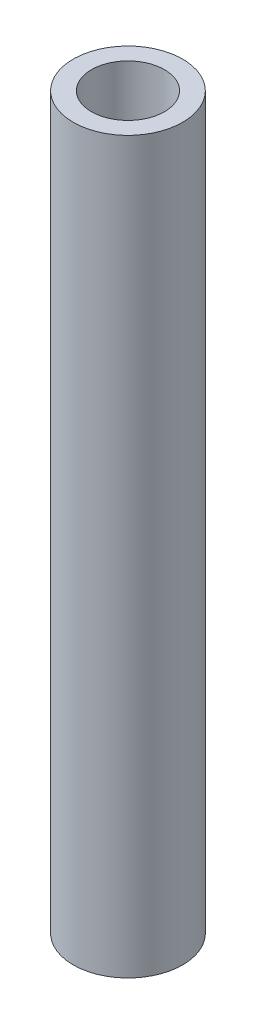
ISO-10303-21;
HEADER;
FILE_DESCRIPTION(('STEP AP214'),'2;1');
FILE_NAME('part.step','',(''),(''),'','','');
FILE_SCHEMA(('AUTOMOTIVE_DESIGN { 1 0 10303 214 1 1 1 1 }'));
ENDSEC;
DATA;
#1=APPLICATION_CONTEXT('core data for automotive mechanical design processes');
#2=APPLICATION_PROTOCOL_DEFINITION('international standard','automotive_design',2000,#1);
#3=PRODUCT_CONTEXT('',#1,'mechanical');
#4=PRODUCT('Part','Part','',(#3));
#5=PRODUCT_RELATED_PRODUCT_CATEGORY('part','',(#4));
#6=PRODUCT_DEFINITION_FORMATION('','',#4);
#7=PRODUCT_DEFINITION_CONTEXT('part definition',#1,'design');
#8=PRODUCT_DEFINITION('design','',#6,#7);
#9=PRODUCT_DEFINITION_SHAPE('','',#8);
#10=(LENGTH_UNIT() NAMED_UNIT(*) SI_UNIT(.MILLI.,.METRE.));
#11=(NAMED_UNIT(*) PLANE_ANGLE_UNIT() SI_UNIT($,.RADIAN.));
#12=(NAMED_UNIT(*) SI_UNIT($,.STERADIAN.) SOLID_ANGLE_UNIT());
#13=UNCERTAINTY_MEASURE_WITH_UNIT(LENGTH_MEASURE(1.E-05),#10,'distance_accuracy_value','');
#14=(GEOMETRIC_REPRESENTATION_CONTEXT(3) GLOBAL_UNCERTAINTY_ASSIGNED_CONTEXT((#13)) GLOBAL_UNIT_ASSIGNED_CONTEXT((#10,
#11,#12)) REPRESENTATION_CONTEXT('',''));
#15=CARTESIAN_POINT('',(0.,0.,0.));
#16=DIRECTION('',(0.,0.,1.));
#17=DIRECTION('',(1.,0.,0.));
#18=AXIS2_PLACEMENT_3D('',#15,#16,#17);
#19=CARTESIAN_POINT('',(0.,127.,0.));
#20=DIRECTION('',(0.,1.,0.));
#21=DIRECTION('',(0.,0.,1.));
#22=AXIS2_PLACEMENT_3D('',#19,#20,#21);
#23=PLANE('',#22);
#24=CARTESIAN_POINT('',(0.,127.,0.));
#25=DIRECTION('',(0.,1.,0.));
#26=DIRECTION('',(0.,0.,1.));
#27=AXIS2_PLACEMENT_3D('',#24,#25,#26);
#28=CIRCLE('',#27,9.525);
#29=CARTESIAN_POINT('',(0.,127.,9.525));
#30=VERTEX_POINT('',#29);
#31=EDGE_CURVE('E10',#30,#30,#28,.T.);
#32=ORIENTED_EDGE('',*,*,#31,.T.);
#33=EDGE_LOOP('',(#32));
#34=FACE_BOUND('',#33,.T.);
#35=CARTESIAN_POINT('',(0.,127.,0.));
#36=DIRECTION('',(0.,1.,0.));
#37=DIRECTION('',(0.,0.,1.));
#38=AXIS2_PLACEMENT_3D('',#35,#36,#37);
#39=CIRCLE('',#38,6.35);
#40=CARTESIAN_POINT('',(0.,127.,6.35));
#41=VERTEX_POINT('',#40);
#42=EDGE_CURVE('E42',#41,#41,#39,.T.);
#43=ORIENTED_EDGE('',*,*,#42,.F.);
#44=EDGE_LOOP('',(#43));
#45=FACE_BOUND('',#44,.T.);
#46=ADVANCED_FACE('F31',(#34,#45),#23,.T.);
#47=CARTESIAN_POINT('',(0.,0.,0.));
#48=DIRECTION('',(0.,1.,0.));
#49=DIRECTION('',(0.,0.,1.));
#50=AXIS2_PLACEMENT_3D('',#47,#48,#49);
#51=PLANE('',#50);
#52=CARTESIAN_POINT('',(0.,0.,0.));
#53=DIRECTION('',(0.,1.,0.));
#54=DIRECTION('',(0.,0.,1.));
#55=AXIS2_PLACEMENT_3D('',#52,#53,#54);
#56=CIRCLE('',#55,9.525);
#57=CARTESIAN_POINT('',(0.,0.,9.525));
#58=VERTEX_POINT('',#57);
#59=EDGE_CURVE('E35',#58,#58,#56,.T.);
#60=ORIENTED_EDGE('',*,*,#59,.F.);
#61=EDGE_LOOP('',(#60));
#62=FACE_BOUND('',#61,.T.);
#63=CARTESIAN_POINT('',(0.,0.,0.));
#64=DIRECTION('',(0.,1.,0.));
#65=DIRECTION('',(0.,0.,1.));
#66=AXIS2_PLACEMENT_3D('',#63,#64,#65);
#67=CIRCLE('',#66,6.35);
#68=CARTESIAN_POINT('',(0.,0.,6.35));
#69=VERTEX_POINT('',#68);
#70=EDGE_CURVE('E44',#69,#69,#67,.T.);
#71=ORIENTED_EDGE('',*,*,#70,.T.);
#72=EDGE_LOOP('',(#71));
#73=FACE_BOUND('',#72,.T.);
#74=ADVANCED_FACE('F54',(#62,#73),#51,.F.);
#75=CARTESIAN_POINT('',(0.,127.,0.));
#76=DIRECTION('',(0.,-1.,0.));
#77=DIRECTION('',(0.,0.,-1.));
#78=AXIS2_PLACEMENT_3D('',#75,#76,#77);
#79=CYLINDRICAL_SURFACE('',#78,9.525);
#80=ORIENTED_EDGE('',*,*,#31,.F.);
#81=EDGE_LOOP('',(#80));
#82=FACE_BOUND('',#81,.T.);
#83=ORIENTED_EDGE('',*,*,#59,.T.);
#84=EDGE_LOOP('',(#83));
#85=FACE_BOUND('',#84,.T.);
#86=ADVANCED_FACE('F33',(#82,#85),#79,.T.);
#87=CARTESIAN_POINT('',(0.,127.,0.));
#88=DIRECTION('',(0.,-1.,0.));
#89=DIRECTION('',(0.,0.,-1.));
#90=AXIS2_PLACEMENT_3D('',#87,#88,#89);
#91=CYLINDRICAL_SURFACE('',#90,6.35);
#92=ORIENTED_EDGE('',*,*,#42,.T.);
#93=EDGE_LOOP('',(#92));
#94=FACE_BOUND('',#93,.T.);
#95=ORIENTED_EDGE('',*,*,#70,.F.);
#96=EDGE_LOOP('',(#95));
#97=FACE_BOUND('',#96,.T.);
#98=ADVANCED_FACE('F50',(#94,#97),#91,.F.);
#99=CLOSED_SHELL('',(#46,#74,#86,#98));
#100=MANIFOLD_SOLID_BREP('B2',#99);
#101=ADVANCED_BREP_SHAPE_REPRESENTATION('',(#18,#100),#14);
#102=SHAPE_DEFINITION_REPRESENTATION(#9,#101);
ENDSEC;
END-ISO-10303-21;
